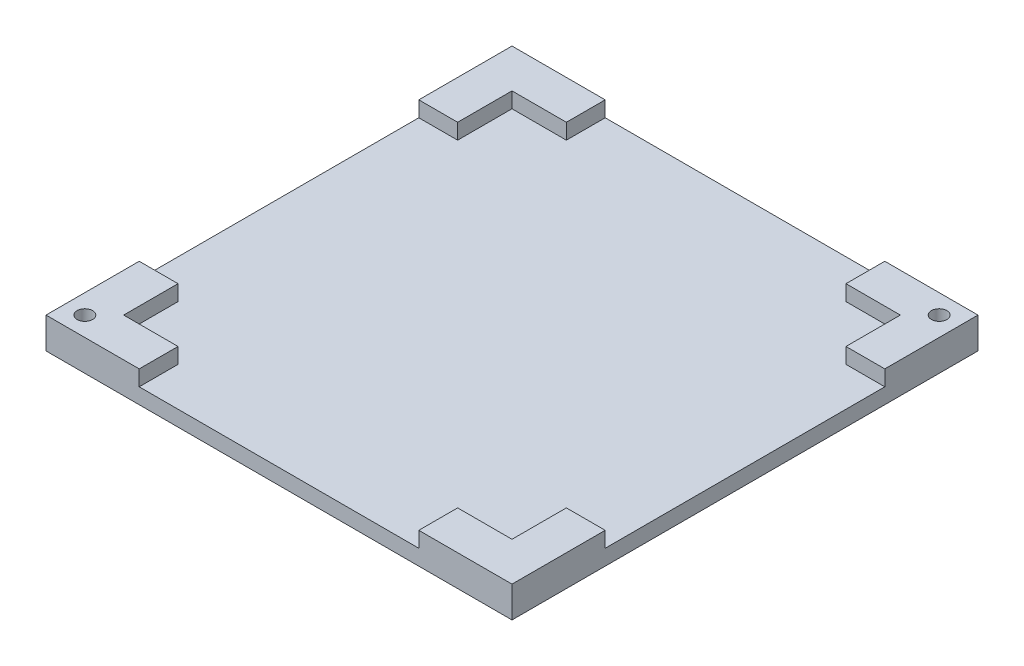
ISO-10303-21;
HEADER;
FILE_DESCRIPTION(('STEP AP214'),'2;1');
FILE_NAME('part.step','',(''),(''),'','','');
FILE_SCHEMA(('AUTOMOTIVE_DESIGN { 1 0 10303 214 1 1 1 1 }'));
ENDSEC;
DATA;
#1=APPLICATION_CONTEXT('core data for automotive mechanical design processes');
#2=APPLICATION_PROTOCOL_DEFINITION('international standard','automotive_design',2000,#1);
#3=PRODUCT_CONTEXT('',#1,'mechanical');
#4=PRODUCT('Part','Part','',(#3));
#5=PRODUCT_RELATED_PRODUCT_CATEGORY('part','',(#4));
#6=PRODUCT_DEFINITION_FORMATION('','',#4);
#7=PRODUCT_DEFINITION_CONTEXT('part definition',#1,'design');
#8=PRODUCT_DEFINITION('design','',#6,#7);
#9=PRODUCT_DEFINITION_SHAPE('','',#8);
#10=(LENGTH_UNIT() NAMED_UNIT(*) SI_UNIT(.MILLI.,.METRE.));
#11=(NAMED_UNIT(*) PLANE_ANGLE_UNIT() SI_UNIT($,.RADIAN.));
#12=(NAMED_UNIT(*) SI_UNIT($,.STERADIAN.) SOLID_ANGLE_UNIT());
#13=UNCERTAINTY_MEASURE_WITH_UNIT(LENGTH_MEASURE(1.E-05),#10,'distance_accuracy_value','');
#14=(GEOMETRIC_REPRESENTATION_CONTEXT(3) GLOBAL_UNCERTAINTY_ASSIGNED_CONTEXT((#13)) GLOBAL_UNIT_ASSIGNED_CONTEXT((#10,
#11,#12)) REPRESENTATION_CONTEXT('',''));
#15=CARTESIAN_POINT('',(0.,0.,0.));
#16=DIRECTION('',(0.,0.,1.));
#17=DIRECTION('',(1.,0.,0.));
#18=AXIS2_PLACEMENT_3D('',#15,#16,#17);
#19=CARTESIAN_POINT('',(0.,10.,0.));
#20=DIRECTION('',(0.,-1.,0.));
#21=DIRECTION('',(0.,0.,-1.));
#22=AXIS2_PLACEMENT_3D('',#19,#20,#21);
#23=PLANE('',#22);
#24=DIRECTION('',(-1.,0.,0.));
#25=VECTOR('',#24,1.);
#26=CARTESIAN_POINT('',(125.,10.,90.));
#27=LINE('',#26,#25);
#28=CARTESIAN_POINT('',(150.,10.,90.));
#29=VERTEX_POINT('',#28);
#30=CARTESIAN_POINT('',(125.,10.,90.));
#31=VERTEX_POINT('',#30);
#32=EDGE_CURVE('E237',#29,#31,#27,.T.);
#33=ORIENTED_EDGE('',*,*,#32,.F.);
#34=DIRECTION('',(0.,0.,-1.));
#35=VECTOR('',#34,1.);
#36=CARTESIAN_POINT('',(150.,10.,150.));
#37=LINE('',#36,#35);
#38=CARTESIAN_POINT('',(150.,10.,-90.));
#39=VERTEX_POINT('',#38);
#40=EDGE_CURVE('E217',#29,#39,#37,.T.);
#41=ORIENTED_EDGE('',*,*,#40,.T.);
#42=DIRECTION('',(1.,0.,0.));
#43=VECTOR('',#42,1.);
#44=CARTESIAN_POINT('',(125.,10.,-90.));
#45=LINE('',#44,#43);
#46=CARTESIAN_POINT('',(125.,10.,-90.));
#47=VERTEX_POINT('',#46);
#48=EDGE_CURVE('E289',#47,#39,#45,.T.);
#49=ORIENTED_EDGE('',*,*,#48,.F.);
#50=DIRECTION('',(0.,0.,1.));
#51=VECTOR('',#50,1.);
#52=CARTESIAN_POINT('',(125.,10.,-125.));
#53=LINE('',#52,#51);
#54=CARTESIAN_POINT('',(125.,10.,-125.));
#55=VERTEX_POINT('',#54);
#56=EDGE_CURVE('E292',#55,#47,#53,.T.);
#57=ORIENTED_EDGE('',*,*,#56,.F.);
#58=DIRECTION('',(1.,0.,0.));
#59=VECTOR('',#58,1.);
#60=CARTESIAN_POINT('',(90.,10.,-125.));
#61=LINE('',#60,#59);
#62=CARTESIAN_POINT('',(90.,10.,-125.));
#63=VERTEX_POINT('',#62);
#64=EDGE_CURVE('E296',#63,#55,#61,.T.);
#65=ORIENTED_EDGE('',*,*,#64,.F.);
#66=DIRECTION('',(0.,0.,1.));
#67=VECTOR('',#66,1.);
#68=CARTESIAN_POINT('',(90.,10.,-150.));
#69=LINE('',#68,#67);
#70=CARTESIAN_POINT('',(90.,10.,-150.));
#71=VERTEX_POINT('',#70);
#72=EDGE_CURVE('E299',#71,#63,#69,.T.);
#73=ORIENTED_EDGE('',*,*,#72,.F.);
#74=DIRECTION('',(-1.,0.,0.));
#75=VECTOR('',#74,1.);
#76=CARTESIAN_POINT('',(-150.,10.,-150.));
#77=LINE('',#76,#75);
#78=CARTESIAN_POINT('',(-90.,10.,-150.));
#79=VERTEX_POINT('',#78);
#80=EDGE_CURVE('E356',#71,#79,#77,.T.);
#81=ORIENTED_EDGE('',*,*,#80,.T.);
#82=DIRECTION('',(0.,0.,-1.));
#83=VECTOR('',#82,1.);
#84=CARTESIAN_POINT('',(-90.,10.,-150.));
#85=LINE('',#84,#83);
#86=CARTESIAN_POINT('',(-90.,10.,-125.));
#87=VERTEX_POINT('',#86);
#88=EDGE_CURVE('E318',#87,#79,#85,.T.);
#89=ORIENTED_EDGE('',*,*,#88,.F.);
#90=DIRECTION('',(1.,0.,0.));
#91=VECTOR('',#90,1.);
#92=CARTESIAN_POINT('',(-90.,10.,-125.));
#93=LINE('',#92,#91);
#94=CARTESIAN_POINT('',(-125.,10.,-125.));
#95=VERTEX_POINT('',#94);
#96=EDGE_CURVE('E335',#95,#87,#93,.T.);
#97=ORIENTED_EDGE('',*,*,#96,.F.);
#98=DIRECTION('',(0.,0.,-1.));
#99=VECTOR('',#98,1.);
#100=CARTESIAN_POINT('',(-125.,10.,-125.));
#101=LINE('',#100,#99);
#102=CARTESIAN_POINT('',(-125.,10.,-90.));
#103=VERTEX_POINT('',#102);
#104=EDGE_CURVE('E332',#103,#95,#101,.T.);
#105=ORIENTED_EDGE('',*,*,#104,.F.);
#106=DIRECTION('',(1.,0.,0.));
#107=VECTOR('',#106,1.);
#108=CARTESIAN_POINT('',(-125.,10.,-90.));
#109=LINE('',#108,#107);
#110=CARTESIAN_POINT('',(-150.,10.,-90.));
#111=VERTEX_POINT('',#110);
#112=EDGE_CURVE('E302',#111,#103,#109,.T.);
#113=ORIENTED_EDGE('',*,*,#112,.F.);
#114=DIRECTION('',(0.,0.,1.));
#115=VECTOR('',#114,1.);
#116=CARTESIAN_POINT('',(-150.,10.,150.));
#117=LINE('',#116,#115);
#118=CARTESIAN_POINT('',(-150.,10.,89.9999999999999));
#119=VERTEX_POINT('',#118);
#120=EDGE_CURVE('E359',#111,#119,#117,.T.);
#121=ORIENTED_EDGE('',*,*,#120,.T.);
#122=DIRECTION('',(-1.,0.,0.));
#123=VECTOR('',#122,1.);
#124=CARTESIAN_POINT('',(-125.,10.,89.9999999999999));
#125=LINE('',#124,#123);
#126=CARTESIAN_POINT('',(-125.,10.,89.9999999999999));
#127=VERTEX_POINT('',#126);
#128=EDGE_CURVE('E250',#127,#119,#125,.T.);
#129=ORIENTED_EDGE('',*,*,#128,.F.);
#130=DIRECTION('',(0.,0.,-1.));
#131=VECTOR('',#130,1.);
#132=CARTESIAN_POINT('',(-125.,10.,125.));
#133=LINE('',#132,#131);
#134=CARTESIAN_POINT('',(-125.,10.,125.));
#135=VERTEX_POINT('',#134);
#136=EDGE_CURVE('E253',#135,#127,#133,.T.);
#137=ORIENTED_EDGE('',*,*,#136,.F.);
#138=DIRECTION('',(-1.,0.,0.));
#139=VECTOR('',#138,1.);
#140=CARTESIAN_POINT('',(-90.0000000000001,10.,125.));
#141=LINE('',#140,#139);
#142=CARTESIAN_POINT('',(-90.0000000000001,10.,125.));
#143=VERTEX_POINT('',#142);
#144=EDGE_CURVE('E257',#143,#135,#141,.T.);
#145=ORIENTED_EDGE('',*,*,#144,.F.);
#146=DIRECTION('',(0.,0.,-1.));
#147=VECTOR('',#146,1.);
#148=CARTESIAN_POINT('',(-90.0000000000001,10.,150.));
#149=LINE('',#148,#147);
#150=CARTESIAN_POINT('',(-90.0000000000001,10.,150.));
#151=VERTEX_POINT('',#150);
#152=EDGE_CURVE('E260',#151,#143,#149,.T.);
#153=ORIENTED_EDGE('',*,*,#152,.F.);
#154=DIRECTION('',(1.,0.,0.));
#155=VECTOR('',#154,1.);
#156=CARTESIAN_POINT('',(-150.,10.,150.));
#157=LINE('',#156,#155);
#158=CARTESIAN_POINT('',(89.9999999999999,10.,150.));
#159=VERTEX_POINT('',#158);
#160=EDGE_CURVE('E361',#151,#159,#157,.T.);
#161=ORIENTED_EDGE('',*,*,#160,.T.);
#162=DIRECTION('',(0.,0.,1.));
#163=VECTOR('',#162,1.);
#164=CARTESIAN_POINT('',(89.9999999999999,10.,150.));
#165=LINE('',#164,#163);
#166=CARTESIAN_POINT('',(89.9999999999999,10.,125.));
#167=VERTEX_POINT('',#166);
#168=EDGE_CURVE('E224',#167,#159,#165,.T.);
#169=ORIENTED_EDGE('',*,*,#168,.F.);
#170=DIRECTION('',(-1.,0.,0.));
#171=VECTOR('',#170,1.);
#172=CARTESIAN_POINT('',(89.9999999999999,10.,125.));
#173=LINE('',#172,#171);
#174=CARTESIAN_POINT('',(125.,10.,125.));
#175=VERTEX_POINT('',#174);
#176=EDGE_CURVE('E61',#175,#167,#173,.T.);
#177=ORIENTED_EDGE('',*,*,#176,.F.);
#178=DIRECTION('',(0.,0.,1.));
#179=VECTOR('',#178,1.);
#180=CARTESIAN_POINT('',(125.,10.,125.));
#181=LINE('',#180,#179);
#182=EDGE_CURVE('E56',#31,#175,#181,.T.);
#183=ORIENTED_EDGE('',*,*,#182,.F.);
#184=EDGE_LOOP('',(#33,#41,#49,#57,#65,#73,#81,#89,#97,#105,#113,#121,#129,#137,#145,#153,#161,
#169,#177,#183));
#185=FACE_BOUND('',#184,.T.);
#186=ADVANCED_FACE('F41',(#185),#23,.F.);
#187=CARTESIAN_POINT('',(150.,10.,150.));
#188=DIRECTION('',(-1.,0.,0.));
#189=DIRECTION('',(0.,0.,1.));
#190=AXIS2_PLACEMENT_3D('',#187,#188,#189);
#191=PLANE('',#190);
#192=DIRECTION('',(0.,0.,-1.));
#193=VECTOR('',#192,1.);
#194=CARTESIAN_POINT('',(150.,0.,150.));
#195=LINE('',#194,#193);
#196=CARTESIAN_POINT('',(150.,0.,150.));
#197=VERTEX_POINT('',#196);
#198=CARTESIAN_POINT('',(150.,0.,-150.));
#199=VERTEX_POINT('',#198);
#200=EDGE_CURVE('E354',#197,#199,#195,.T.);
#201=ORIENTED_EDGE('',*,*,#200,.T.);
#202=DIRECTION('',(0.,-1.,0.));
#203=VECTOR('',#202,1.);
#204=CARTESIAN_POINT('',(150.,10.,-150.));
#205=LINE('',#204,#203);
#206=CARTESIAN_POINT('',(150.,20.,-150.));
#207=VERTEX_POINT('',#206);
#208=EDGE_CURVE('E11',#207,#199,#205,.T.);
#209=ORIENTED_EDGE('',*,*,#208,.F.);
#210=DIRECTION('',(0.,0.,-1.));
#211=VECTOR('',#210,1.);
#212=CARTESIAN_POINT('',(150.,20.,-90.));
#213=LINE('',#212,#211);
#214=CARTESIAN_POINT('',(150.,20.,-90.));
#215=VERTEX_POINT('',#214);
#216=EDGE_CURVE('E293',#215,#207,#213,.T.);
#217=ORIENTED_EDGE('',*,*,#216,.F.);
#218=DIRECTION('',(0.,-1.,0.));
#219=VECTOR('',#218,1.);
#220=CARTESIAN_POINT('',(150.,20.,-90.));
#221=LINE('',#220,#219);
#222=EDGE_CURVE('E286',#215,#39,#221,.T.);
#223=ORIENTED_EDGE('',*,*,#222,.T.);
#224=ORIENTED_EDGE('',*,*,#40,.F.);
#225=DIRECTION('',(0.,-1.,0.));
#226=VECTOR('',#225,1.);
#227=CARTESIAN_POINT('',(150.,20.,90.));
#228=LINE('',#227,#226);
#229=CARTESIAN_POINT('',(150.,20.,90.));
#230=VERTEX_POINT('',#229);
#231=EDGE_CURVE('E211',#230,#29,#228,.T.);
#232=ORIENTED_EDGE('',*,*,#231,.F.);
#233=DIRECTION('',(0.,0.,-1.));
#234=VECTOR('',#233,1.);
#235=CARTESIAN_POINT('',(150.,20.,90.));
#236=LINE('',#235,#234);
#237=CARTESIAN_POINT('',(150.,20.,150.));
#238=VERTEX_POINT('',#237);
#239=EDGE_CURVE('E201',#238,#230,#236,.T.);
#240=ORIENTED_EDGE('',*,*,#239,.F.);
#241=DIRECTION('',(0.,-1.,0.));
#242=VECTOR('',#241,1.);
#243=CARTESIAN_POINT('',(150.,10.,150.));
#244=LINE('',#243,#242);
#245=EDGE_CURVE('E363',#238,#197,#244,.T.);
#246=ORIENTED_EDGE('',*,*,#245,.T.);
#247=EDGE_LOOP('',(#201,#209,#217,#223,#224,#232,#240,#246));
#248=FACE_BOUND('',#247,.T.);
#249=ADVANCED_FACE('F43',(#248),#191,.F.);
#250=CARTESIAN_POINT('',(-150.,10.,-150.));
#251=DIRECTION('',(0.,0.,1.));
#252=DIRECTION('',(1.,0.,0.));
#253=AXIS2_PLACEMENT_3D('',#250,#251,#252);
#254=PLANE('',#253);
#255=DIRECTION('',(-1.,0.,0.));
#256=VECTOR('',#255,1.);
#257=CARTESIAN_POINT('',(-150.,0.,-150.));
#258=LINE('',#257,#256);
#259=CARTESIAN_POINT('',(-150.,0.,-150.));
#260=VERTEX_POINT('',#259);
#261=EDGE_CURVE('E365',#199,#260,#258,.T.);
#262=ORIENTED_EDGE('',*,*,#261,.T.);
#263=DIRECTION('',(0.,-1.,0.));
#264=VECTOR('',#263,1.);
#265=CARTESIAN_POINT('',(-150.,10.,-150.));
#266=LINE('',#265,#264);
#267=CARTESIAN_POINT('',(-150.,20.,-150.));
#268=VERTEX_POINT('',#267);
#269=EDGE_CURVE('E49',#268,#260,#266,.T.);
#270=ORIENTED_EDGE('',*,*,#269,.F.);
#271=DIRECTION('',(-1.,0.,0.));
#272=VECTOR('',#271,1.);
#273=CARTESIAN_POINT('',(-150.,20.,-150.));
#274=LINE('',#273,#272);
#275=CARTESIAN_POINT('',(-90.,20.,-150.));
#276=VERTEX_POINT('',#275);
#277=EDGE_CURVE('E324',#276,#268,#274,.T.);
#278=ORIENTED_EDGE('',*,*,#277,.F.);
#279=DIRECTION('',(0.,-1.,0.));
#280=VECTOR('',#279,1.);
#281=CARTESIAN_POINT('',(-90.,20.,-150.));
#282=LINE('',#281,#280);
#283=EDGE_CURVE('E342',#276,#79,#282,.T.);
#284=ORIENTED_EDGE('',*,*,#283,.T.);
#285=ORIENTED_EDGE('',*,*,#80,.F.);
#286=DIRECTION('',(0.,-1.,0.));
#287=VECTOR('',#286,1.);
#288=CARTESIAN_POINT('',(90.,20.,-150.));
#289=LINE('',#288,#287);
#290=CARTESIAN_POINT('',(90.,20.,-150.));
#291=VERTEX_POINT('',#290);
#292=EDGE_CURVE('E263',#291,#71,#289,.T.);
#293=ORIENTED_EDGE('',*,*,#292,.F.);
#294=DIRECTION('',(-1.,0.,0.));
#295=VECTOR('',#294,1.);
#296=CARTESIAN_POINT('',(150.,20.,-150.));
#297=LINE('',#296,#295);
#298=EDGE_CURVE('E310',#207,#291,#297,.T.);
#299=ORIENTED_EDGE('',*,*,#298,.F.);
#300=ORIENTED_EDGE('',*,*,#208,.T.);
#301=EDGE_LOOP('',(#262,#270,#278,#284,#285,#293,#299,#300));
#302=FACE_BOUND('',#301,.T.);
#303=ADVANCED_FACE('F391',(#302),#254,.F.);
#304=CARTESIAN_POINT('',(-150.,10.,150.));
#305=DIRECTION('',(1.,0.,0.));
#306=DIRECTION('',(0.,0.,-1.));
#307=AXIS2_PLACEMENT_3D('',#304,#305,#306);
#308=PLANE('',#307);
#309=DIRECTION('',(0.,0.,1.));
#310=VECTOR('',#309,1.);
#311=CARTESIAN_POINT('',(-150.,0.,150.));
#312=LINE('',#311,#310);
#313=CARTESIAN_POINT('',(-150.,0.,150.));
#314=VERTEX_POINT('',#313);
#315=EDGE_CURVE('E367',#260,#314,#312,.T.);
#316=ORIENTED_EDGE('',*,*,#315,.T.);
#317=DIRECTION('',(0.,-1.,0.));
#318=VECTOR('',#317,1.);
#319=CARTESIAN_POINT('',(-150.,10.,150.));
#320=LINE('',#319,#318);
#321=CARTESIAN_POINT('',(-150.,20.,150.));
#322=VERTEX_POINT('',#321);
#323=EDGE_CURVE('E371',#322,#314,#320,.T.);
#324=ORIENTED_EDGE('',*,*,#323,.F.);
#325=DIRECTION('',(0.,0.,1.));
#326=VECTOR('',#325,1.);
#327=CARTESIAN_POINT('',(-150.,20.,89.9999999999999));
#328=LINE('',#327,#326);
#329=CARTESIAN_POINT('',(-150.,20.,89.9999999999999));
#330=VERTEX_POINT('',#329);
#331=EDGE_CURVE('E254',#330,#322,#328,.T.);
#332=ORIENTED_EDGE('',*,*,#331,.F.);
#333=DIRECTION('',(0.,-1.,0.));
#334=VECTOR('',#333,1.);
#335=CARTESIAN_POINT('',(-150.,20.,89.9999999999999));
#336=LINE('',#335,#334);
#337=EDGE_CURVE('E246',#330,#119,#336,.T.);
#338=ORIENTED_EDGE('',*,*,#337,.T.);
#339=ORIENTED_EDGE('',*,*,#120,.F.);
#340=DIRECTION('',(0.,-1.,0.));
#341=VECTOR('',#340,1.);
#342=CARTESIAN_POINT('',(-150.,20.,-90.));
#343=LINE('',#342,#341);
#344=CARTESIAN_POINT('',(-150.,20.,-90.));
#345=VERTEX_POINT('',#344);
#346=EDGE_CURVE('E329',#345,#111,#343,.T.);
#347=ORIENTED_EDGE('',*,*,#346,.F.);
#348=DIRECTION('',(0.,0.,1.));
#349=VECTOR('',#348,1.);
#350=CARTESIAN_POINT('',(-150.,20.,-90.));
#351=LINE('',#350,#349);
#352=EDGE_CURVE('E327',#268,#345,#351,.T.);
#353=ORIENTED_EDGE('',*,*,#352,.F.);
#354=ORIENTED_EDGE('',*,*,#269,.T.);
#355=EDGE_LOOP('',(#316,#324,#332,#338,#339,#347,#353,#354));
#356=FACE_BOUND('',#355,.T.);
#357=ADVANCED_FACE('F377',(#356),#308,.F.);
#358=CARTESIAN_POINT('',(-150.,10.,150.));
#359=DIRECTION('',(0.,0.,-1.));
#360=DIRECTION('',(-1.,0.,0.));
#361=AXIS2_PLACEMENT_3D('',#358,#359,#360);
#362=PLANE('',#361);
#363=DIRECTION('',(1.,0.,0.));
#364=VECTOR('',#363,1.);
#365=CARTESIAN_POINT('',(-150.,0.,150.));
#366=LINE('',#365,#364);
#367=EDGE_CURVE('E357',#314,#197,#366,.T.);
#368=ORIENTED_EDGE('',*,*,#367,.T.);
#369=ORIENTED_EDGE('',*,*,#245,.F.);
#370=DIRECTION('',(1.,0.,0.));
#371=VECTOR('',#370,1.);
#372=CARTESIAN_POINT('',(150.,20.,150.));
#373=LINE('',#372,#371);
#374=CARTESIAN_POINT('',(89.9999999999999,20.,150.));
#375=VERTEX_POINT('',#374);
#376=EDGE_CURVE('E208',#375,#238,#373,.T.);
#377=ORIENTED_EDGE('',*,*,#376,.F.);
#378=DIRECTION('',(0.,-1.,0.));
#379=VECTOR('',#378,1.);
#380=CARTESIAN_POINT('',(89.9999999999999,20.,150.));
#381=LINE('',#380,#379);
#382=EDGE_CURVE('E220',#375,#159,#381,.T.);
#383=ORIENTED_EDGE('',*,*,#382,.T.);
#384=ORIENTED_EDGE('',*,*,#160,.F.);
#385=DIRECTION('',(0.,-1.,0.));
#386=VECTOR('',#385,1.);
#387=CARTESIAN_POINT('',(-90.0000000000001,20.,150.));
#388=LINE('',#387,#386);
#389=CARTESIAN_POINT('',(-90.0000000000001,20.,150.));
#390=VERTEX_POINT('',#389);
#391=EDGE_CURVE('E233',#390,#151,#388,.T.);
#392=ORIENTED_EDGE('',*,*,#391,.F.);
#393=DIRECTION('',(1.,0.,0.));
#394=VECTOR('',#393,1.);
#395=CARTESIAN_POINT('',(-150.,20.,150.));
#396=LINE('',#395,#394);
#397=EDGE_CURVE('E271',#322,#390,#396,.T.);
#398=ORIENTED_EDGE('',*,*,#397,.F.);
#399=ORIENTED_EDGE('',*,*,#323,.T.);
#400=EDGE_LOOP('',(#368,#369,#377,#383,#384,#392,#398,#399));
#401=FACE_BOUND('',#400,.T.);
#402=ADVANCED_FACE('F386',(#401),#362,.F.);
#403=CARTESIAN_POINT('',(0.,0.,0.));
#404=DIRECTION('',(0.,-1.,0.));
#405=DIRECTION('',(0.,0.,-1.));
#406=AXIS2_PLACEMENT_3D('',#403,#404,#405);
#407=PLANE('',#406);
#408=ORIENTED_EDGE('',*,*,#200,.F.);
#409=ORIENTED_EDGE('',*,*,#367,.F.);
#410=ORIENTED_EDGE('',*,*,#315,.F.);
#411=ORIENTED_EDGE('',*,*,#261,.F.);
#412=EDGE_LOOP('',(#408,#409,#410,#411));
#413=FACE_BOUND('',#412,.T.);
#414=ADVANCED_FACE('F384',(#413),#407,.T.);
#415=CARTESIAN_POINT('',(-125.,20.,-90.));
#416=DIRECTION('',(0.,0.,-1.));
#417=DIRECTION('',(-1.,0.,0.));
#418=AXIS2_PLACEMENT_3D('',#415,#416,#417);
#419=PLANE('',#418);
#420=ORIENTED_EDGE('',*,*,#112,.T.);
#421=DIRECTION('',(0.,-1.,0.));
#422=VECTOR('',#421,1.);
#423=CARTESIAN_POINT('',(-125.,20.,-90.));
#424=LINE('',#423,#422);
#425=CARTESIAN_POINT('',(-125.,20.,-90.));
#426=VERTEX_POINT('',#425);
#427=EDGE_CURVE('E351',#426,#103,#424,.T.);
#428=ORIENTED_EDGE('',*,*,#427,.F.);
#429=DIRECTION('',(1.,0.,0.));
#430=VECTOR('',#429,1.);
#431=CARTESIAN_POINT('',(-125.,20.,-90.));
#432=LINE('',#431,#430);
#433=EDGE_CURVE('E314',#345,#426,#432,.T.);
#434=ORIENTED_EDGE('',*,*,#433,.F.);
#435=ORIENTED_EDGE('',*,*,#346,.T.);
#436=EDGE_LOOP('',(#420,#428,#434,#435));
#437=FACE_BOUND('',#436,.T.);
#438=ADVANCED_FACE('F431',(#437),#419,.F.);
#439=CARTESIAN_POINT('',(-125.,20.,-125.));
#440=DIRECTION('',(-1.,0.,0.));
#441=DIRECTION('',(0.,0.,1.));
#442=AXIS2_PLACEMENT_3D('',#439,#440,#441);
#443=PLANE('',#442);
#444=ORIENTED_EDGE('',*,*,#104,.T.);
#445=DIRECTION('',(0.,-1.,0.));
#446=VECTOR('',#445,1.);
#447=CARTESIAN_POINT('',(-125.,20.,-125.));
#448=LINE('',#447,#446);
#449=CARTESIAN_POINT('',(-125.,20.,-125.));
#450=VERTEX_POINT('',#449);
#451=EDGE_CURVE('E348',#450,#95,#448,.T.);
#452=ORIENTED_EDGE('',*,*,#451,.F.);
#453=DIRECTION('',(0.,0.,-1.));
#454=VECTOR('',#453,1.);
#455=CARTESIAN_POINT('',(-125.,20.,-125.));
#456=LINE('',#455,#454);
#457=EDGE_CURVE('E317',#426,#450,#456,.T.);
#458=ORIENTED_EDGE('',*,*,#457,.F.);
#459=ORIENTED_EDGE('',*,*,#427,.T.);
#460=EDGE_LOOP('',(#444,#452,#458,#459));
#461=FACE_BOUND('',#460,.T.);
#462=ADVANCED_FACE('F459',(#461),#443,.F.);
#463=CARTESIAN_POINT('',(-90.,20.,-125.));
#464=DIRECTION('',(0.,0.,-1.));
#465=DIRECTION('',(-1.,0.,0.));
#466=AXIS2_PLACEMENT_3D('',#463,#464,#465);
#467=PLANE('',#466);
#468=ORIENTED_EDGE('',*,*,#96,.T.);
#469=DIRECTION('',(0.,-1.,0.));
#470=VECTOR('',#469,1.);
#471=CARTESIAN_POINT('',(-90.,20.,-125.));
#472=LINE('',#471,#470);
#473=CARTESIAN_POINT('',(-90.,20.,-125.));
#474=VERTEX_POINT('',#473);
#475=EDGE_CURVE('E345',#474,#87,#472,.T.);
#476=ORIENTED_EDGE('',*,*,#475,.F.);
#477=DIRECTION('',(1.,0.,0.));
#478=VECTOR('',#477,1.);
#479=CARTESIAN_POINT('',(-90.,20.,-125.));
#480=LINE('',#479,#478);
#481=EDGE_CURVE('E320',#450,#474,#480,.T.);
#482=ORIENTED_EDGE('',*,*,#481,.F.);
#483=ORIENTED_EDGE('',*,*,#451,.T.);
#484=EDGE_LOOP('',(#468,#476,#482,#483));
#485=FACE_BOUND('',#484,.T.);
#486=ADVANCED_FACE('F467',(#485),#467,.F.);
#487=CARTESIAN_POINT('',(-90.,20.,-150.));
#488=DIRECTION('',(-1.,0.,0.));
#489=DIRECTION('',(0.,0.,1.));
#490=AXIS2_PLACEMENT_3D('',#487,#488,#489);
#491=PLANE('',#490);
#492=ORIENTED_EDGE('',*,*,#88,.T.);
#493=ORIENTED_EDGE('',*,*,#283,.F.);
#494=DIRECTION('',(0.,0.,-1.));
#495=VECTOR('',#494,1.);
#496=CARTESIAN_POINT('',(-90.,20.,-150.));
#497=LINE('',#496,#495);
#498=EDGE_CURVE('E322',#474,#276,#497,.T.);
#499=ORIENTED_EDGE('',*,*,#498,.F.);
#500=ORIENTED_EDGE('',*,*,#475,.T.);
#501=EDGE_LOOP('',(#492,#493,#499,#500));
#502=FACE_BOUND('',#501,.T.);
#503=ADVANCED_FACE('F419',(#502),#491,.F.);
#504=CARTESIAN_POINT('',(0.,20.,0.));
#505=DIRECTION('',(0.,-1.,0.));
#506=DIRECTION('',(0.,0.,-1.));
#507=AXIS2_PLACEMENT_3D('',#504,#505,#506);
#508=PLANE('',#507);
#509=ORIENTED_EDGE('',*,*,#433,.T.);
#510=ORIENTED_EDGE('',*,*,#457,.T.);
#511=ORIENTED_EDGE('',*,*,#481,.T.);
#512=ORIENTED_EDGE('',*,*,#498,.T.);
#513=ORIENTED_EDGE('',*,*,#277,.T.);
#514=ORIENTED_EDGE('',*,*,#352,.T.);
#515=EDGE_LOOP('',(#509,#510,#511,#512,#513,#514));
#516=FACE_BOUND('',#515,.T.);
#517=ADVANCED_FACE('F412',(#516),#508,.F.);
#518=CARTESIAN_POINT('',(90.,20.,-150.));
#519=DIRECTION('',(1.,0.,0.));
#520=DIRECTION('',(0.,0.,-1.));
#521=AXIS2_PLACEMENT_3D('',#518,#519,#520);
#522=PLANE('',#521);
#523=ORIENTED_EDGE('',*,*,#72,.T.);
#524=DIRECTION('',(0.,-1.,0.));
#525=VECTOR('',#524,1.);
#526=CARTESIAN_POINT('',(90.,20.,-125.));
#527=LINE('',#526,#525);
#528=CARTESIAN_POINT('',(90.,20.,-125.));
#529=VERTEX_POINT('',#528);
#530=EDGE_CURVE('E277',#529,#63,#527,.T.);
#531=ORIENTED_EDGE('',*,*,#530,.F.);
#532=DIRECTION('',(0.,0.,1.));
#533=VECTOR('',#532,1.);
#534=CARTESIAN_POINT('',(90.,20.,-150.));
#535=LINE('',#534,#533);
#536=EDGE_CURVE('E308',#291,#529,#535,.T.);
#537=ORIENTED_EDGE('',*,*,#536,.F.);
#538=ORIENTED_EDGE('',*,*,#292,.T.);
#539=EDGE_LOOP('',(#523,#531,#537,#538));
#540=FACE_BOUND('',#539,.T.);
#541=ADVANCED_FACE('F410',(#540),#522,.F.);
#542=CARTESIAN_POINT('',(90.,20.,-125.));
#543=DIRECTION('',(0.,0.,-1.));
#544=DIRECTION('',(-1.,0.,0.));
#545=AXIS2_PLACEMENT_3D('',#542,#543,#544);
#546=PLANE('',#545);
#547=ORIENTED_EDGE('',*,*,#64,.T.);
#548=DIRECTION('',(0.,-1.,0.));
#549=VECTOR('',#548,1.);
#550=CARTESIAN_POINT('',(125.,20.,-125.));
#551=LINE('',#550,#549);
#552=CARTESIAN_POINT('',(125.,20.,-125.));
#553=VERTEX_POINT('',#552);
#554=EDGE_CURVE('E280',#553,#55,#551,.T.);
#555=ORIENTED_EDGE('',*,*,#554,.F.);
#556=DIRECTION('',(1.,0.,0.));
#557=VECTOR('',#556,1.);
#558=CARTESIAN_POINT('',(90.,20.,-125.));
#559=LINE('',#558,#557);
#560=EDGE_CURVE('E306',#529,#553,#559,.T.);
#561=ORIENTED_EDGE('',*,*,#560,.F.);
#562=ORIENTED_EDGE('',*,*,#530,.T.);
#563=EDGE_LOOP('',(#547,#555,#561,#562));
#564=FACE_BOUND('',#563,.T.);
#565=ADVANCED_FACE('F406',(#564),#546,.F.);
#566=CARTESIAN_POINT('',(125.,20.,-125.));
#567=DIRECTION('',(1.,0.,0.));
#568=DIRECTION('',(0.,0.,-1.));
#569=AXIS2_PLACEMENT_3D('',#566,#567,#568);
#570=PLANE('',#569);
#571=ORIENTED_EDGE('',*,*,#56,.T.);
#572=DIRECTION('',(0.,-1.,0.));
#573=VECTOR('',#572,1.);
#574=CARTESIAN_POINT('',(125.,20.,-90.));
#575=LINE('',#574,#573);
#576=CARTESIAN_POINT('',(125.,20.,-90.));
#577=VERTEX_POINT('',#576);
#578=EDGE_CURVE('E283',#577,#47,#575,.T.);
#579=ORIENTED_EDGE('',*,*,#578,.F.);
#580=DIRECTION('',(0.,0.,1.));
#581=VECTOR('',#580,1.);
#582=CARTESIAN_POINT('',(125.,20.,-125.));
#583=LINE('',#582,#581);
#584=EDGE_CURVE('E304',#553,#577,#583,.T.);
#585=ORIENTED_EDGE('',*,*,#584,.F.);
#586=ORIENTED_EDGE('',*,*,#554,.T.);
#587=EDGE_LOOP('',(#571,#579,#585,#586));
#588=FACE_BOUND('',#587,.T.);
#589=ADVANCED_FACE('F402',(#588),#570,.F.);
#590=CARTESIAN_POINT('',(125.,20.,-90.));
#591=DIRECTION('',(0.,0.,-1.));
#592=DIRECTION('',(-1.,0.,0.));
#593=AXIS2_PLACEMENT_3D('',#590,#591,#592);
#594=PLANE('',#593);
#595=ORIENTED_EDGE('',*,*,#48,.T.);
#596=ORIENTED_EDGE('',*,*,#222,.F.);
#597=DIRECTION('',(1.,0.,0.));
#598=VECTOR('',#597,1.);
#599=CARTESIAN_POINT('',(125.,20.,-90.));
#600=LINE('',#599,#598);
#601=EDGE_CURVE('E288',#577,#215,#600,.T.);
#602=ORIENTED_EDGE('',*,*,#601,.F.);
#603=ORIENTED_EDGE('',*,*,#578,.T.);
#604=EDGE_LOOP('',(#595,#596,#602,#603));
#605=FACE_BOUND('',#604,.T.);
#606=ADVANCED_FACE('F400',(#605),#594,.F.);
#607=CARTESIAN_POINT('',(0.,20.,0.));
#608=DIRECTION('',(0.,1.,0.));
#609=DIRECTION('',(0.,0.,1.));
#610=AXIS2_PLACEMENT_3D('',#607,#608,#609);
#611=PLANE('',#610);
#612=CARTESIAN_POINT('',(137.5,20.,-137.5));
#613=DIRECTION('',(0.,1.,0.));
#614=DIRECTION('',(0.,0.,1.));
#615=AXIS2_PLACEMENT_3D('',#612,#613,#614);
#616=CIRCLE('',#615,4.99999999999999);
#617=CARTESIAN_POINT('',(137.5,20.,-132.5));
#618=VERTEX_POINT('',#617);
#619=EDGE_CURVE('E666',#618,#618,#616,.T.);
#620=ORIENTED_EDGE('',*,*,#619,.F.);
#621=EDGE_LOOP('',(#620));
#622=FACE_BOUND('',#621,.T.);
#623=ORIENTED_EDGE('',*,*,#216,.T.);
#624=ORIENTED_EDGE('',*,*,#298,.T.);
#625=ORIENTED_EDGE('',*,*,#536,.T.);
#626=ORIENTED_EDGE('',*,*,#560,.T.);
#627=ORIENTED_EDGE('',*,*,#584,.T.);
#628=ORIENTED_EDGE('',*,*,#601,.T.);
#629=EDGE_LOOP('',(#623,#624,#625,#626,#627,#628));
#630=FACE_BOUND('',#629,.T.);
#631=ADVANCED_FACE('F394',(#622,#630),#611,.T.);
#632=CARTESIAN_POINT('',(-90.0000000000001,20.,150.));
#633=DIRECTION('',(-1.,0.,0.));
#634=DIRECTION('',(0.,0.,1.));
#635=AXIS2_PLACEMENT_3D('',#632,#633,#634);
#636=PLANE('',#635);
#637=ORIENTED_EDGE('',*,*,#152,.T.);
#638=DIRECTION('',(0.,-1.,0.));
#639=VECTOR('',#638,1.);
#640=CARTESIAN_POINT('',(-90.0000000000001,20.,125.));
#641=LINE('',#640,#639);
#642=CARTESIAN_POINT('',(-90.0000000000001,20.,125.));
#643=VERTEX_POINT('',#642);
#644=EDGE_CURVE('E236',#643,#143,#641,.T.);
#645=ORIENTED_EDGE('',*,*,#644,.F.);
#646=DIRECTION('',(0.,0.,-1.));
#647=VECTOR('',#646,1.);
#648=CARTESIAN_POINT('',(-90.0000000000001,20.,150.));
#649=LINE('',#648,#647);
#650=EDGE_CURVE('E269',#390,#643,#649,.T.);
#651=ORIENTED_EDGE('',*,*,#650,.F.);
#652=ORIENTED_EDGE('',*,*,#391,.T.);
#653=EDGE_LOOP('',(#637,#645,#651,#652));
#654=FACE_BOUND('',#653,.T.);
#655=ADVANCED_FACE('F526',(#654),#636,.F.);
#656=CARTESIAN_POINT('',(-90.0000000000001,20.,125.));
#657=DIRECTION('',(0.,0.,1.));
#658=DIRECTION('',(1.,0.,0.));
#659=AXIS2_PLACEMENT_3D('',#656,#657,#658);
#660=PLANE('',#659);
#661=ORIENTED_EDGE('',*,*,#144,.T.);
#662=DIRECTION('',(0.,-1.,0.));
#663=VECTOR('',#662,1.);
#664=CARTESIAN_POINT('',(-125.,20.,125.));
#665=LINE('',#664,#663);
#666=CARTESIAN_POINT('',(-125.,20.,125.));
#667=VERTEX_POINT('',#666);
#668=EDGE_CURVE('E240',#667,#135,#665,.T.);
#669=ORIENTED_EDGE('',*,*,#668,.F.);
#670=DIRECTION('',(-1.,0.,0.));
#671=VECTOR('',#670,1.);
#672=CARTESIAN_POINT('',(-90.0000000000001,20.,125.));
#673=LINE('',#672,#671);
#674=EDGE_CURVE('E267',#643,#667,#673,.T.);
#675=ORIENTED_EDGE('',*,*,#674,.F.);
#676=ORIENTED_EDGE('',*,*,#644,.T.);
#677=EDGE_LOOP('',(#661,#669,#675,#676));
#678=FACE_BOUND('',#677,.T.);
#679=ADVANCED_FACE('F537',(#678),#660,.F.);
#680=CARTESIAN_POINT('',(-125.,20.,125.));
#681=DIRECTION('',(-1.,0.,0.));
#682=DIRECTION('',(0.,0.,1.));
#683=AXIS2_PLACEMENT_3D('',#680,#681,#682);
#684=PLANE('',#683);
#685=ORIENTED_EDGE('',*,*,#136,.T.);
#686=DIRECTION('',(0.,-1.,0.));
#687=VECTOR('',#686,1.);
#688=CARTESIAN_POINT('',(-125.,20.,89.9999999999999));
#689=LINE('',#688,#687);
#690=CARTESIAN_POINT('',(-125.,20.,89.9999999999999));
#691=VERTEX_POINT('',#690);
#692=EDGE_CURVE('E243',#691,#127,#689,.T.);
#693=ORIENTED_EDGE('',*,*,#692,.F.);
#694=DIRECTION('',(0.,0.,-1.));
#695=VECTOR('',#694,1.);
#696=CARTESIAN_POINT('',(-125.,20.,125.));
#697=LINE('',#696,#695);
#698=EDGE_CURVE('E265',#667,#691,#697,.T.);
#699=ORIENTED_EDGE('',*,*,#698,.F.);
#700=ORIENTED_EDGE('',*,*,#668,.T.);
#701=EDGE_LOOP('',(#685,#693,#699,#700));
#702=FACE_BOUND('',#701,.T.);
#703=ADVANCED_FACE('F547',(#702),#684,.F.);
#704=CARTESIAN_POINT('',(-125.,20.,89.9999999999999));
#705=DIRECTION('',(0.,0.,1.));
#706=DIRECTION('',(1.,0.,0.));
#707=AXIS2_PLACEMENT_3D('',#704,#705,#706);
#708=PLANE('',#707);
#709=ORIENTED_EDGE('',*,*,#128,.T.);
#710=ORIENTED_EDGE('',*,*,#337,.F.);
#711=DIRECTION('',(-1.,0.,0.));
#712=VECTOR('',#711,1.);
#713=CARTESIAN_POINT('',(-125.,20.,89.9999999999999));
#714=LINE('',#713,#712);
#715=EDGE_CURVE('E249',#691,#330,#714,.T.);
#716=ORIENTED_EDGE('',*,*,#715,.F.);
#717=ORIENTED_EDGE('',*,*,#692,.T.);
#718=EDGE_LOOP('',(#709,#710,#716,#717));
#719=FACE_BOUND('',#718,.T.);
#720=ADVANCED_FACE('F557',(#719),#708,.F.);
#721=CARTESIAN_POINT('',(0.,20.,0.));
#722=DIRECTION('',(0.,1.,0.));
#723=DIRECTION('',(0.,0.,1.));
#724=AXIS2_PLACEMENT_3D('',#721,#722,#723);
#725=PLANE('',#724);
#726=CARTESIAN_POINT('',(-137.5,20.,137.5));
#727=DIRECTION('',(0.,1.,0.));
#728=DIRECTION('',(0.,0.,1.));
#729=AXIS2_PLACEMENT_3D('',#726,#727,#728);
#730=CIRCLE('',#729,4.99999999999999);
#731=CARTESIAN_POINT('',(-137.5,20.,142.5));
#732=VERTEX_POINT('',#731);
#733=EDGE_CURVE('E669',#732,#732,#730,.T.);
#734=ORIENTED_EDGE('',*,*,#733,.F.);
#735=EDGE_LOOP('',(#734));
#736=FACE_BOUND('',#735,.T.);
#737=ORIENTED_EDGE('',*,*,#331,.T.);
#738=ORIENTED_EDGE('',*,*,#397,.T.);
#739=ORIENTED_EDGE('',*,*,#650,.T.);
#740=ORIENTED_EDGE('',*,*,#674,.T.);
#741=ORIENTED_EDGE('',*,*,#698,.T.);
#742=ORIENTED_EDGE('',*,*,#715,.T.);
#743=EDGE_LOOP('',(#737,#738,#739,#740,#741,#742));
#744=FACE_BOUND('',#743,.T.);
#745=ADVANCED_FACE('F567',(#736,#744),#725,.T.);
#746=CARTESIAN_POINT('',(125.,20.,90.));
#747=DIRECTION('',(0.,0.,1.));
#748=DIRECTION('',(1.,0.,0.));
#749=AXIS2_PLACEMENT_3D('',#746,#747,#748);
#750=PLANE('',#749);
#751=ORIENTED_EDGE('',*,*,#32,.T.);
#752=DIRECTION('',(0.,-1.,0.));
#753=VECTOR('',#752,1.);
#754=CARTESIAN_POINT('',(125.,20.,90.));
#755=LINE('',#754,#753);
#756=CARTESIAN_POINT('',(125.,20.,90.));
#757=VERTEX_POINT('',#756);
#758=EDGE_CURVE('E223',#757,#31,#755,.T.);
#759=ORIENTED_EDGE('',*,*,#758,.F.);
#760=DIRECTION('',(-1.,0.,0.));
#761=VECTOR('',#760,1.);
#762=CARTESIAN_POINT('',(125.,20.,90.));
#763=LINE('',#762,#761);
#764=EDGE_CURVE('E205',#230,#757,#763,.T.);
#765=ORIENTED_EDGE('',*,*,#764,.F.);
#766=ORIENTED_EDGE('',*,*,#231,.T.);
#767=EDGE_LOOP('',(#751,#759,#765,#766));
#768=FACE_BOUND('',#767,.T.);
#769=ADVANCED_FACE('F222',(#768),#750,.F.);
#770=CARTESIAN_POINT('',(125.,20.,125.));
#771=DIRECTION('',(1.,0.,0.));
#772=DIRECTION('',(0.,0.,-1.));
#773=AXIS2_PLACEMENT_3D('',#770,#771,#772);
#774=PLANE('',#773);
#775=ORIENTED_EDGE('',*,*,#182,.T.);
#776=DIRECTION('',(0.,-1.,0.));
#777=VECTOR('',#776,1.);
#778=CARTESIAN_POINT('',(125.,20.,125.));
#779=LINE('',#778,#777);
#780=CARTESIAN_POINT('',(125.,20.,125.));
#781=VERTEX_POINT('',#780);
#782=EDGE_CURVE('E674',#781,#175,#779,.T.);
#783=ORIENTED_EDGE('',*,*,#782,.F.);
#784=DIRECTION('',(0.,0.,1.));
#785=VECTOR('',#784,1.);
#786=CARTESIAN_POINT('',(125.,20.,125.));
#787=LINE('',#786,#785);
#788=EDGE_CURVE('E225',#757,#781,#787,.T.);
#789=ORIENTED_EDGE('',*,*,#788,.F.);
#790=ORIENTED_EDGE('',*,*,#758,.T.);
#791=EDGE_LOOP('',(#775,#783,#789,#790));
#792=FACE_BOUND('',#791,.T.);
#793=ADVANCED_FACE('F585',(#792),#774,.F.);
#794=CARTESIAN_POINT('',(89.9999999999999,20.,125.));
#795=DIRECTION('',(0.,0.,1.));
#796=DIRECTION('',(1.,0.,0.));
#797=AXIS2_PLACEMENT_3D('',#794,#795,#796);
#798=PLANE('',#797);
#799=ORIENTED_EDGE('',*,*,#176,.T.);
#800=DIRECTION('',(0.,-1.,0.));
#801=VECTOR('',#800,1.);
#802=CARTESIAN_POINT('',(89.9999999999999,20.,125.));
#803=LINE('',#802,#801);
#804=CARTESIAN_POINT('',(89.9999999999999,20.,125.));
#805=VERTEX_POINT('',#804);
#806=EDGE_CURVE('E678',#805,#167,#803,.T.);
#807=ORIENTED_EDGE('',*,*,#806,.F.);
#808=DIRECTION('',(-1.,0.,0.));
#809=VECTOR('',#808,1.);
#810=CARTESIAN_POINT('',(89.9999999999999,20.,125.));
#811=LINE('',#810,#809);
#812=EDGE_CURVE('E229',#781,#805,#811,.T.);
#813=ORIENTED_EDGE('',*,*,#812,.F.);
#814=ORIENTED_EDGE('',*,*,#782,.T.);
#815=EDGE_LOOP('',(#799,#807,#813,#814));
#816=FACE_BOUND('',#815,.T.);
#817=ADVANCED_FACE('F594',(#816),#798,.F.);
#818=CARTESIAN_POINT('',(89.9999999999999,20.,150.));
#819=DIRECTION('',(1.,0.,0.));
#820=DIRECTION('',(0.,0.,-1.));
#821=AXIS2_PLACEMENT_3D('',#818,#819,#820);
#822=PLANE('',#821);
#823=ORIENTED_EDGE('',*,*,#168,.T.);
#824=ORIENTED_EDGE('',*,*,#382,.F.);
#825=DIRECTION('',(0.,0.,1.));
#826=VECTOR('',#825,1.);
#827=CARTESIAN_POINT('',(89.9999999999999,20.,150.));
#828=LINE('',#827,#826);
#829=EDGE_CURVE('E687',#805,#375,#828,.T.);
#830=ORIENTED_EDGE('',*,*,#829,.F.);
#831=ORIENTED_EDGE('',*,*,#806,.T.);
#832=EDGE_LOOP('',(#823,#824,#830,#831));
#833=FACE_BOUND('',#832,.T.);
#834=ADVANCED_FACE('F604',(#833),#822,.F.);
#835=CARTESIAN_POINT('',(0.,20.,0.));
#836=DIRECTION('',(0.,-1.,0.));
#837=DIRECTION('',(0.,0.,-1.));
#838=AXIS2_PLACEMENT_3D('',#835,#836,#837);
#839=PLANE('',#838);
#840=ORIENTED_EDGE('',*,*,#764,.T.);
#841=ORIENTED_EDGE('',*,*,#788,.T.);
#842=ORIENTED_EDGE('',*,*,#812,.T.);
#843=ORIENTED_EDGE('',*,*,#829,.T.);
#844=ORIENTED_EDGE('',*,*,#376,.T.);
#845=ORIENTED_EDGE('',*,*,#239,.T.);
#846=EDGE_LOOP('',(#840,#841,#842,#843,#844,#845));
#847=FACE_BOUND('',#846,.T.);
#848=ADVANCED_FACE('F203',(#847),#839,.F.);
#849=CARTESIAN_POINT('',(-137.5,5.,137.5));
#850=DIRECTION('',(0.,1.,0.));
#851=DIRECTION('',(0.,0.,1.));
#852=AXIS2_PLACEMENT_3D('',#849,#850,#851);
#853=CYLINDRICAL_SURFACE('',#852,4.99999999999999);
#854=CARTESIAN_POINT('',(-137.5,5.,137.5));
#855=DIRECTION('',(0.,1.,0.));
#856=DIRECTION('',(0.,0.,1.));
#857=AXIS2_PLACEMENT_3D('',#854,#855,#856);
#858=CIRCLE('',#857,4.99999999999999);
#859=CARTESIAN_POINT('',(-137.5,5.,142.5));
#860=VERTEX_POINT('',#859);
#861=EDGE_CURVE('E675',#860,#860,#858,.T.);
#862=ORIENTED_EDGE('',*,*,#861,.F.);
#863=EDGE_LOOP('',(#862));
#864=FACE_BOUND('',#863,.T.);
#865=ORIENTED_EDGE('',*,*,#733,.T.);
#866=EDGE_LOOP('',(#865));
#867=FACE_BOUND('',#866,.T.);
#868=ADVANCED_FACE('F622',(#864,#867),#853,.F.);
#869=CARTESIAN_POINT('',(-137.5,5.,137.5));
#870=DIRECTION('',(0.,1.,0.));
#871=DIRECTION('',(0.,0.,1.));
#872=AXIS2_PLACEMENT_3D('',#869,#870,#871);
#873=PLANE('',#872);
#874=ORIENTED_EDGE('',*,*,#861,.T.);
#875=EDGE_LOOP('',(#874));
#876=FACE_BOUND('',#875,.T.);
#877=ADVANCED_FACE('F630',(#876),#873,.T.);
#878=CARTESIAN_POINT('',(137.5,5.,-137.5));
#879=DIRECTION('',(0.,1.,0.));
#880=DIRECTION('',(0.,0.,1.));
#881=AXIS2_PLACEMENT_3D('',#878,#879,#880);
#882=CYLINDRICAL_SURFACE('',#881,4.99999999999999);
#883=CARTESIAN_POINT('',(137.5,5.,-137.5));
#884=DIRECTION('',(0.,1.,0.));
#885=DIRECTION('',(0.,0.,1.));
#886=AXIS2_PLACEMENT_3D('',#883,#884,#885);
#887=CIRCLE('',#886,4.99999999999999);
#888=CARTESIAN_POINT('',(137.5,5.,-132.5));
#889=VERTEX_POINT('',#888);
#890=EDGE_CURVE('E665',#889,#889,#887,.T.);
#891=ORIENTED_EDGE('',*,*,#890,.F.);
#892=EDGE_LOOP('',(#891));
#893=FACE_BOUND('',#892,.T.);
#894=ORIENTED_EDGE('',*,*,#619,.T.);
#895=EDGE_LOOP('',(#894));
#896=FACE_BOUND('',#895,.T.);
#897=ADVANCED_FACE('F640',(#893,#896),#882,.F.);
#898=CARTESIAN_POINT('',(137.5,5.,-137.5));
#899=DIRECTION('',(0.,1.,0.));
#900=DIRECTION('',(0.,0.,1.));
#901=AXIS2_PLACEMENT_3D('',#898,#899,#900);
#902=PLANE('',#901);
#903=ORIENTED_EDGE('',*,*,#890,.T.);
#904=EDGE_LOOP('',(#903));
#905=FACE_BOUND('',#904,.T.);
#906=ADVANCED_FACE('F650',(#905),#902,.T.);
#907=CLOSED_SHELL('',(#186,#249,#303,#357,#402,#414,#438,#462,#486,#503,#517,#541,#565,#589,
#606,#631,#655,#679,#703,#720,#745,#769,#793,#817,#834,#848,#868,#877,#897,#906));
#908=MANIFOLD_SOLID_BREP('B2',#907);
#909=ADVANCED_BREP_SHAPE_REPRESENTATION('',(#18,#908),#14);
#910=SHAPE_DEFINITION_REPRESENTATION(#9,#909);
ENDSEC;
END-ISO-10303-21;
